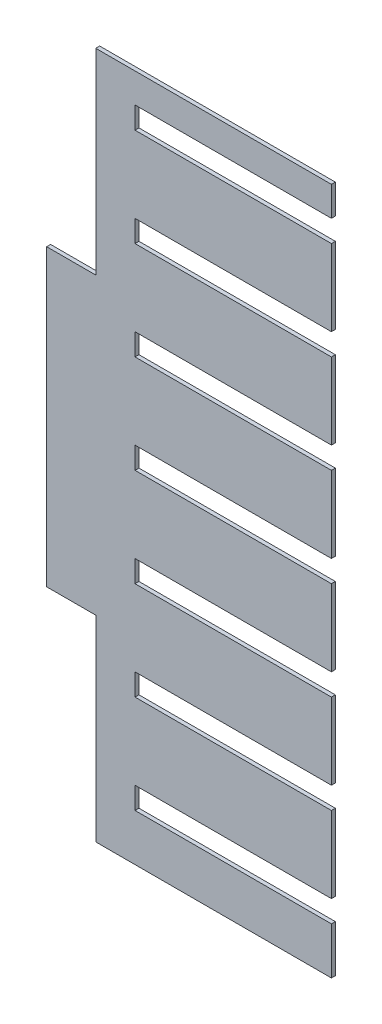
ISO-10303-21;
HEADER;
FILE_DESCRIPTION(('STEP AP214'),'2;1');
FILE_NAME('part.step','',(''),(''),'','','');
FILE_SCHEMA(('AUTOMOTIVE_DESIGN { 1 0 10303 214 1 1 1 1 }'));
ENDSEC;
DATA;
#1=APPLICATION_CONTEXT('core data for automotive mechanical design processes');
#2=APPLICATION_PROTOCOL_DEFINITION('international standard','automotive_design',2000,#1);
#3=PRODUCT_CONTEXT('',#1,'mechanical');
#4=PRODUCT('Part','Part','',(#3));
#5=PRODUCT_RELATED_PRODUCT_CATEGORY('part','',(#4));
#6=PRODUCT_DEFINITION_FORMATION('','',#4);
#7=PRODUCT_DEFINITION_CONTEXT('part definition',#1,'design');
#8=PRODUCT_DEFINITION('design','',#6,#7);
#9=PRODUCT_DEFINITION_SHAPE('','',#8);
#10=(LENGTH_UNIT() NAMED_UNIT(*) SI_UNIT(.MILLI.,.METRE.));
#11=(NAMED_UNIT(*) PLANE_ANGLE_UNIT() SI_UNIT($,.RADIAN.));
#12=(NAMED_UNIT(*) SI_UNIT($,.STERADIAN.) SOLID_ANGLE_UNIT());
#13=UNCERTAINTY_MEASURE_WITH_UNIT(LENGTH_MEASURE(1.E-05),#10,'distance_accuracy_value','');
#14=(GEOMETRIC_REPRESENTATION_CONTEXT(3) GLOBAL_UNCERTAINTY_ASSIGNED_CONTEXT((#13)) GLOBAL_UNIT_ASSIGNED_CONTEXT((#10,
#11,#12)) REPRESENTATION_CONTEXT('',''));
#15=CARTESIAN_POINT('',(0.,0.,0.));
#16=DIRECTION('',(0.,0.,1.));
#17=DIRECTION('',(1.,0.,0.));
#18=AXIS2_PLACEMENT_3D('',#15,#16,#17);
#19=CARTESIAN_POINT('',(-30.0000000000001,-151.123940721398,0.));
#20=DIRECTION('',(0.,-1.,0.));
#21=DIRECTION('',(0.,0.,-1.));
#22=AXIS2_PLACEMENT_3D('',#19,#20,#21);
#23=PLANE('',#22);
#24=DIRECTION('',(1.,0.,0.));
#25=VECTOR('',#24,1.);
#26=CARTESIAN_POINT('',(-30.0000000000001,-151.123940721398,2.));
#27=LINE('',#26,#25);
#28=CARTESIAN_POINT('',(-130.,-151.123940721398,2.));
#29=VERTEX_POINT('',#28);
#30=CARTESIAN_POINT('',(-30.,-151.123940721398,2.));
#31=VERTEX_POINT('',#30);
#32=EDGE_CURVE('E452',#29,#31,#27,.T.);
#33=ORIENTED_EDGE('',*,*,#32,.T.);
#34=DIRECTION('',(0.,0.,1.));
#35=VECTOR('',#34,1.);
#36=CARTESIAN_POINT('',(-30.0000000000001,-151.123940721398,0.));
#37=LINE('',#36,#35);
#38=CARTESIAN_POINT('',(-30.,-151.123940721398,0.));
#39=VERTEX_POINT('',#38);
#40=EDGE_CURVE('E11',#39,#31,#37,.T.);
#41=ORIENTED_EDGE('',*,*,#40,.F.);
#42=DIRECTION('',(1.,0.,0.));
#43=VECTOR('',#42,1.);
#44=CARTESIAN_POINT('',(-30.0000000000001,-151.123940721398,0.));
#45=LINE('',#44,#43);
#46=CARTESIAN_POINT('',(-130.,-151.123940721398,0.));
#47=VERTEX_POINT('',#46);
#48=EDGE_CURVE('E456',#47,#39,#45,.T.);
#49=ORIENTED_EDGE('',*,*,#48,.F.);
#50=DIRECTION('',(0.,0.,1.));
#51=VECTOR('',#50,1.);
#52=CARTESIAN_POINT('',(-130.,-151.123940721398,0.));
#53=LINE('',#52,#51);
#54=EDGE_CURVE('E461',#47,#29,#53,.T.);
#55=ORIENTED_EDGE('',*,*,#54,.T.);
#56=EDGE_LOOP('',(#33,#41,#49,#55));
#57=FACE_BOUND('',#56,.T.);
#58=ADVANCED_FACE('F34',(#57),#23,.F.);
#59=CARTESIAN_POINT('',(-130.,-140.,0.));
#60=DIRECTION('',(0.,1.,0.));
#61=DIRECTION('',(-1.,0.,0.));
#62=AXIS2_PLACEMENT_3D('',#59,#60,#61);
#63=PLANE('',#62);
#64=DIRECTION('',(-1.,0.,0.));
#65=VECTOR('',#64,1.);
#66=CARTESIAN_POINT('',(-130.,-140.,2.));
#67=LINE('',#66,#65);
#68=CARTESIAN_POINT('',(-30.,-140.,2.));
#69=VERTEX_POINT('',#68);
#70=CARTESIAN_POINT('',(-130.,-140.,2.));
#71=VERTEX_POINT('',#70);
#72=EDGE_CURVE('E449',#69,#71,#67,.T.);
#73=ORIENTED_EDGE('',*,*,#72,.T.);
#74=DIRECTION('',(0.,0.,1.));
#75=VECTOR('',#74,1.);
#76=CARTESIAN_POINT('',(-130.,-140.,0.));
#77=LINE('',#76,#75);
#78=CARTESIAN_POINT('',(-130.,-140.,0.));
#79=VERTEX_POINT('',#78);
#80=EDGE_CURVE('E464',#79,#71,#77,.T.);
#81=ORIENTED_EDGE('',*,*,#80,.F.);
#82=DIRECTION('',(-1.,0.,0.));
#83=VECTOR('',#82,1.);
#84=CARTESIAN_POINT('',(-130.,-140.,0.));
#85=LINE('',#84,#83);
#86=CARTESIAN_POINT('',(-30.0000000000001,-140.,0.));
#87=VERTEX_POINT('',#86);
#88=EDGE_CURVE('E459',#87,#79,#85,.T.);
#89=ORIENTED_EDGE('',*,*,#88,.F.);
#90=DIRECTION('',(0.,0.,1.));
#91=VECTOR('',#90,1.);
#92=CARTESIAN_POINT('',(-30.0000000000001,-140.,0.));
#93=LINE('',#92,#91);
#94=EDGE_CURVE('E41',#87,#69,#93,.T.);
#95=ORIENTED_EDGE('',*,*,#94,.T.);
#96=EDGE_LOOP('',(#73,#81,#89,#95));
#97=FACE_BOUND('',#96,.T.);
#98=ADVANCED_FACE('F468',(#97),#63,.F.);
#99=CARTESIAN_POINT('',(-130.,-151.123940721398,0.));
#100=DIRECTION('',(-1.,0.,0.));
#101=DIRECTION('',(0.,0.,1.));
#102=AXIS2_PLACEMENT_3D('',#99,#100,#101);
#103=PLANE('',#102);
#104=DIRECTION('',(0.,-1.,0.));
#105=VECTOR('',#104,1.);
#106=CARTESIAN_POINT('',(-130.,-151.123940721398,2.));
#107=LINE('',#106,#105);
#108=EDGE_CURVE('E447',#71,#29,#107,.T.);
#109=ORIENTED_EDGE('',*,*,#108,.T.);
#110=ORIENTED_EDGE('',*,*,#54,.F.);
#111=DIRECTION('',(0.,-1.,0.));
#112=VECTOR('',#111,1.);
#113=CARTESIAN_POINT('',(-130.,-151.123940721398,0.));
#114=LINE('',#113,#112);
#115=EDGE_CURVE('E56',#79,#47,#114,.T.);
#116=ORIENTED_EDGE('',*,*,#115,.F.);
#117=ORIENTED_EDGE('',*,*,#80,.T.);
#118=EDGE_LOOP('',(#109,#110,#116,#117));
#119=FACE_BOUND('',#118,.T.);
#120=ADVANCED_FACE('F580',(#119),#103,.F.);
#121=CARTESIAN_POINT('',(-30.0000000000001,-101.123940721397,0.));
#122=DIRECTION('',(0.,-1.,0.));
#123=DIRECTION('',(0.,0.,-1.));
#124=AXIS2_PLACEMENT_3D('',#121,#122,#123);
#125=PLANE('',#124);
#126=DIRECTION('',(1.,0.,0.));
#127=VECTOR('',#126,1.);
#128=CARTESIAN_POINT('',(-30.0000000000001,-101.123940721397,2.));
#129=LINE('',#128,#127);
#130=CARTESIAN_POINT('',(-130.,-101.123940721397,2.));
#131=VERTEX_POINT('',#130);
#132=CARTESIAN_POINT('',(-30.,-101.123940721397,2.));
#133=VERTEX_POINT('',#132);
#134=EDGE_CURVE('E425',#131,#133,#129,.T.);
#135=ORIENTED_EDGE('',*,*,#134,.T.);
#136=DIRECTION('',(0.,0.,1.));
#137=VECTOR('',#136,1.);
#138=CARTESIAN_POINT('',(-30.0000000000001,-101.123940721397,0.));
#139=LINE('',#138,#137);
#140=CARTESIAN_POINT('',(-30.,-101.123940721397,0.));
#141=VERTEX_POINT('',#140);
#142=EDGE_CURVE('E445',#141,#133,#139,.T.);
#143=ORIENTED_EDGE('',*,*,#142,.F.);
#144=DIRECTION('',(1.,0.,0.));
#145=VECTOR('',#144,1.);
#146=CARTESIAN_POINT('',(-30.0000000000001,-101.123940721397,0.));
#147=LINE('',#146,#145);
#148=CARTESIAN_POINT('',(-130.,-101.123940721397,0.));
#149=VERTEX_POINT('',#148);
#150=EDGE_CURVE('E430',#149,#141,#147,.T.);
#151=ORIENTED_EDGE('',*,*,#150,.F.);
#152=DIRECTION('',(0.,0.,1.));
#153=VECTOR('',#152,1.);
#154=CARTESIAN_POINT('',(-130.,-101.123940721397,0.));
#155=LINE('',#154,#153);
#156=EDGE_CURVE('E436',#149,#131,#155,.T.);
#157=ORIENTED_EDGE('',*,*,#156,.T.);
#158=EDGE_LOOP('',(#135,#143,#151,#157));
#159=FACE_BOUND('',#158,.T.);
#160=ADVANCED_FACE('F582',(#159),#125,.F.);
#161=CARTESIAN_POINT('',(-130.,-90.,0.));
#162=DIRECTION('',(0.,1.,0.));
#163=DIRECTION('',(-1.,0.,0.));
#164=AXIS2_PLACEMENT_3D('',#161,#162,#163);
#165=PLANE('',#164);
#166=DIRECTION('',(-1.,0.,0.));
#167=VECTOR('',#166,1.);
#168=CARTESIAN_POINT('',(-130.,-90.,2.));
#169=LINE('',#168,#167);
#170=CARTESIAN_POINT('',(-30.,-90.,2.));
#171=VERTEX_POINT('',#170);
#172=CARTESIAN_POINT('',(-130.,-90.,2.));
#173=VERTEX_POINT('',#172);
#174=EDGE_CURVE('E422',#171,#173,#169,.T.);
#175=ORIENTED_EDGE('',*,*,#174,.T.);
#176=DIRECTION('',(0.,0.,1.));
#177=VECTOR('',#176,1.);
#178=CARTESIAN_POINT('',(-130.,-90.,0.));
#179=LINE('',#178,#177);
#180=CARTESIAN_POINT('',(-130.,-90.,0.));
#181=VERTEX_POINT('',#180);
#182=EDGE_CURVE('E439',#181,#173,#179,.T.);
#183=ORIENTED_EDGE('',*,*,#182,.F.);
#184=DIRECTION('',(-1.,0.,0.));
#185=VECTOR('',#184,1.);
#186=CARTESIAN_POINT('',(-130.,-90.,0.));
#187=LINE('',#186,#185);
#188=CARTESIAN_POINT('',(-30.0000000000001,-90.,0.));
#189=VERTEX_POINT('',#188);
#190=EDGE_CURVE('E433',#189,#181,#187,.T.);
#191=ORIENTED_EDGE('',*,*,#190,.F.);
#192=DIRECTION('',(0.,0.,1.));
#193=VECTOR('',#192,1.);
#194=CARTESIAN_POINT('',(-30.0000000000001,-90.,0.));
#195=LINE('',#194,#193);
#196=EDGE_CURVE('E442',#189,#171,#195,.T.);
#197=ORIENTED_EDGE('',*,*,#196,.T.);
#198=EDGE_LOOP('',(#175,#183,#191,#197));
#199=FACE_BOUND('',#198,.T.);
#200=ADVANCED_FACE('F588',(#199),#165,.F.);
#201=CARTESIAN_POINT('',(-130.,-101.123940721397,0.));
#202=DIRECTION('',(-1.,0.,0.));
#203=DIRECTION('',(0.,0.,1.));
#204=AXIS2_PLACEMENT_3D('',#201,#202,#203);
#205=PLANE('',#204);
#206=DIRECTION('',(0.,-1.,0.));
#207=VECTOR('',#206,1.);
#208=CARTESIAN_POINT('',(-130.,-101.123940721397,2.));
#209=LINE('',#208,#207);
#210=EDGE_CURVE('E420',#173,#131,#209,.T.);
#211=ORIENTED_EDGE('',*,*,#210,.T.);
#212=ORIENTED_EDGE('',*,*,#156,.F.);
#213=DIRECTION('',(0.,-1.,0.));
#214=VECTOR('',#213,1.);
#215=CARTESIAN_POINT('',(-130.,-101.123940721397,0.));
#216=LINE('',#215,#214);
#217=EDGE_CURVE('E428',#181,#149,#216,.T.);
#218=ORIENTED_EDGE('',*,*,#217,.F.);
#219=ORIENTED_EDGE('',*,*,#182,.T.);
#220=EDGE_LOOP('',(#211,#212,#218,#219));
#221=FACE_BOUND('',#220,.T.);
#222=ADVANCED_FACE('F615',(#221),#205,.F.);
#223=CARTESIAN_POINT('',(-30.0000000000001,-51.1239407213975,0.));
#224=DIRECTION('',(0.,-1.,0.));
#225=DIRECTION('',(0.,0.,-1.));
#226=AXIS2_PLACEMENT_3D('',#223,#224,#225);
#227=PLANE('',#226);
#228=DIRECTION('',(1.,0.,0.));
#229=VECTOR('',#228,1.);
#230=CARTESIAN_POINT('',(-30.0000000000001,-51.1239407213975,2.));
#231=LINE('',#230,#229);
#232=CARTESIAN_POINT('',(-130.,-51.1239407213975,2.));
#233=VERTEX_POINT('',#232);
#234=CARTESIAN_POINT('',(-30.0000000000001,-51.1239407213975,2.));
#235=VERTEX_POINT('',#234);
#236=EDGE_CURVE('E398',#233,#235,#231,.T.);
#237=ORIENTED_EDGE('',*,*,#236,.T.);
#238=DIRECTION('',(0.,0.,1.));
#239=VECTOR('',#238,1.);
#240=CARTESIAN_POINT('',(-30.0000000000001,-51.1239407213975,0.));
#241=LINE('',#240,#239);
#242=CARTESIAN_POINT('',(-30.0000000000001,-51.1239407213975,0.));
#243=VERTEX_POINT('',#242);
#244=EDGE_CURVE('E418',#243,#235,#241,.T.);
#245=ORIENTED_EDGE('',*,*,#244,.F.);
#246=DIRECTION('',(1.,0.,0.));
#247=VECTOR('',#246,1.);
#248=CARTESIAN_POINT('',(-30.0000000000001,-51.1239407213975,0.));
#249=LINE('',#248,#247);
#250=CARTESIAN_POINT('',(-130.,-51.1239407213975,0.));
#251=VERTEX_POINT('',#250);
#252=EDGE_CURVE('E403',#251,#243,#249,.T.);
#253=ORIENTED_EDGE('',*,*,#252,.F.);
#254=DIRECTION('',(0.,0.,1.));
#255=VECTOR('',#254,1.);
#256=CARTESIAN_POINT('',(-130.,-51.1239407213975,0.));
#257=LINE('',#256,#255);
#258=EDGE_CURVE('E409',#251,#233,#257,.T.);
#259=ORIENTED_EDGE('',*,*,#258,.T.);
#260=EDGE_LOOP('',(#237,#245,#253,#259));
#261=FACE_BOUND('',#260,.T.);
#262=ADVANCED_FACE('F623',(#261),#227,.F.);
#263=CARTESIAN_POINT('',(-130.,-40.,0.));
#264=DIRECTION('',(0.,1.,0.));
#265=DIRECTION('',(-1.,0.,0.));
#266=AXIS2_PLACEMENT_3D('',#263,#264,#265);
#267=PLANE('',#266);
#268=DIRECTION('',(-1.,0.,0.));
#269=VECTOR('',#268,1.);
#270=CARTESIAN_POINT('',(-130.,-40.,2.));
#271=LINE('',#270,#269);
#272=CARTESIAN_POINT('',(-30.0000000000001,-40.,2.));
#273=VERTEX_POINT('',#272);
#274=CARTESIAN_POINT('',(-130.,-40.,2.));
#275=VERTEX_POINT('',#274);
#276=EDGE_CURVE('E395',#273,#275,#271,.T.);
#277=ORIENTED_EDGE('',*,*,#276,.T.);
#278=DIRECTION('',(0.,0.,1.));
#279=VECTOR('',#278,1.);
#280=CARTESIAN_POINT('',(-130.,-40.,0.));
#281=LINE('',#280,#279);
#282=CARTESIAN_POINT('',(-130.,-40.,0.));
#283=VERTEX_POINT('',#282);
#284=EDGE_CURVE('E412',#283,#275,#281,.T.);
#285=ORIENTED_EDGE('',*,*,#284,.F.);
#286=DIRECTION('',(-1.,0.,0.));
#287=VECTOR('',#286,1.);
#288=CARTESIAN_POINT('',(-130.,-40.,0.));
#289=LINE('',#288,#287);
#290=CARTESIAN_POINT('',(-30.0000000000001,-40.,0.));
#291=VERTEX_POINT('',#290);
#292=EDGE_CURVE('E406',#291,#283,#289,.T.);
#293=ORIENTED_EDGE('',*,*,#292,.F.);
#294=DIRECTION('',(0.,0.,1.));
#295=VECTOR('',#294,1.);
#296=CARTESIAN_POINT('',(-30.0000000000001,-40.,0.));
#297=LINE('',#296,#295);
#298=EDGE_CURVE('E415',#291,#273,#297,.T.);
#299=ORIENTED_EDGE('',*,*,#298,.T.);
#300=EDGE_LOOP('',(#277,#285,#293,#299));
#301=FACE_BOUND('',#300,.T.);
#302=ADVANCED_FACE('F628',(#301),#267,.F.);
#303=CARTESIAN_POINT('',(-130.,-51.1239407213975,0.));
#304=DIRECTION('',(-1.,0.,0.));
#305=DIRECTION('',(0.,0.,1.));
#306=AXIS2_PLACEMENT_3D('',#303,#304,#305);
#307=PLANE('',#306);
#308=DIRECTION('',(0.,-1.,0.));
#309=VECTOR('',#308,1.);
#310=CARTESIAN_POINT('',(-130.,-51.1239407213975,2.));
#311=LINE('',#310,#309);
#312=EDGE_CURVE('E393',#275,#233,#311,.T.);
#313=ORIENTED_EDGE('',*,*,#312,.T.);
#314=ORIENTED_EDGE('',*,*,#258,.F.);
#315=DIRECTION('',(0.,-1.,0.));
#316=VECTOR('',#315,1.);
#317=CARTESIAN_POINT('',(-130.,-51.1239407213975,0.));
#318=LINE('',#317,#316);
#319=EDGE_CURVE('E401',#283,#251,#318,.T.);
#320=ORIENTED_EDGE('',*,*,#319,.F.);
#321=ORIENTED_EDGE('',*,*,#284,.T.);
#322=EDGE_LOOP('',(#313,#314,#320,#321));
#323=FACE_BOUND('',#322,.T.);
#324=ADVANCED_FACE('F638',(#323),#307,.F.);
#325=CARTESIAN_POINT('',(-30.0000000000001,-1.12394072139749,0.));
#326=DIRECTION('',(0.,-1.,0.));
#327=DIRECTION('',(0.,0.,-1.));
#328=AXIS2_PLACEMENT_3D('',#325,#326,#327);
#329=PLANE('',#328);
#330=DIRECTION('',(1.,0.,0.));
#331=VECTOR('',#330,1.);
#332=CARTESIAN_POINT('',(-30.0000000000001,-1.12394072139749,2.));
#333=LINE('',#332,#331);
#334=CARTESIAN_POINT('',(-130.,-1.12394072139749,2.));
#335=VERTEX_POINT('',#334);
#336=CARTESIAN_POINT('',(-30.0000000000001,-1.12394072139749,2.));
#337=VERTEX_POINT('',#336);
#338=EDGE_CURVE('E371',#335,#337,#333,.T.);
#339=ORIENTED_EDGE('',*,*,#338,.T.);
#340=DIRECTION('',(0.,0.,1.));
#341=VECTOR('',#340,1.);
#342=CARTESIAN_POINT('',(-30.0000000000001,-1.12394072139749,0.));
#343=LINE('',#342,#341);
#344=CARTESIAN_POINT('',(-30.0000000000001,-1.12394072139749,0.));
#345=VERTEX_POINT('',#344);
#346=EDGE_CURVE('E391',#345,#337,#343,.T.);
#347=ORIENTED_EDGE('',*,*,#346,.F.);
#348=DIRECTION('',(1.,0.,0.));
#349=VECTOR('',#348,1.);
#350=CARTESIAN_POINT('',(-30.0000000000001,-1.12394072139749,0.));
#351=LINE('',#350,#349);
#352=CARTESIAN_POINT('',(-130.,-1.12394072139749,0.));
#353=VERTEX_POINT('',#352);
#354=EDGE_CURVE('E376',#353,#345,#351,.T.);
#355=ORIENTED_EDGE('',*,*,#354,.F.);
#356=DIRECTION('',(0.,0.,1.));
#357=VECTOR('',#356,1.);
#358=CARTESIAN_POINT('',(-130.,-1.12394072139749,0.));
#359=LINE('',#358,#357);
#360=EDGE_CURVE('E382',#353,#335,#359,.T.);
#361=ORIENTED_EDGE('',*,*,#360,.T.);
#362=EDGE_LOOP('',(#339,#347,#355,#361));
#363=FACE_BOUND('',#362,.T.);
#364=ADVANCED_FACE('F646',(#363),#329,.F.);
#365=CARTESIAN_POINT('',(-130.,9.99999999999998,0.));
#366=DIRECTION('',(0.,1.,0.));
#367=DIRECTION('',(-1.,0.,0.));
#368=AXIS2_PLACEMENT_3D('',#365,#366,#367);
#369=PLANE('',#368);
#370=DIRECTION('',(-1.,0.,0.));
#371=VECTOR('',#370,1.);
#372=CARTESIAN_POINT('',(-130.,9.99999999999998,2.));
#373=LINE('',#372,#371);
#374=CARTESIAN_POINT('',(-30.0000000000001,9.99999999999995,2.));
#375=VERTEX_POINT('',#374);
#376=CARTESIAN_POINT('',(-130.,9.99999999999998,2.));
#377=VERTEX_POINT('',#376);
#378=EDGE_CURVE('E368',#375,#377,#373,.T.);
#379=ORIENTED_EDGE('',*,*,#378,.T.);
#380=DIRECTION('',(0.,0.,1.));
#381=VECTOR('',#380,1.);
#382=CARTESIAN_POINT('',(-130.,9.99999999999998,0.));
#383=LINE('',#382,#381);
#384=CARTESIAN_POINT('',(-130.,9.99999999999998,0.));
#385=VERTEX_POINT('',#384);
#386=EDGE_CURVE('E385',#385,#377,#383,.T.);
#387=ORIENTED_EDGE('',*,*,#386,.F.);
#388=DIRECTION('',(-1.,0.,0.));
#389=VECTOR('',#388,1.);
#390=CARTESIAN_POINT('',(-130.,9.99999999999998,0.));
#391=LINE('',#390,#389);
#392=CARTESIAN_POINT('',(-30.0000000000001,9.99999999999995,0.));
#393=VERTEX_POINT('',#392);
#394=EDGE_CURVE('E379',#393,#385,#391,.T.);
#395=ORIENTED_EDGE('',*,*,#394,.F.);
#396=DIRECTION('',(0.,0.,1.));
#397=VECTOR('',#396,1.);
#398=CARTESIAN_POINT('',(-30.0000000000001,9.99999999999995,0.));
#399=LINE('',#398,#397);
#400=EDGE_CURVE('E388',#393,#375,#399,.T.);
#401=ORIENTED_EDGE('',*,*,#400,.T.);
#402=EDGE_LOOP('',(#379,#387,#395,#401));
#403=FACE_BOUND('',#402,.T.);
#404=ADVANCED_FACE('F651',(#403),#369,.F.);
#405=CARTESIAN_POINT('',(-130.,-1.12394072139749,0.));
#406=DIRECTION('',(-1.,0.,0.));
#407=DIRECTION('',(0.,0.,1.));
#408=AXIS2_PLACEMENT_3D('',#405,#406,#407);
#409=PLANE('',#408);
#410=DIRECTION('',(0.,-1.,0.));
#411=VECTOR('',#410,1.);
#412=CARTESIAN_POINT('',(-130.,-1.12394072139749,2.));
#413=LINE('',#412,#411);
#414=EDGE_CURVE('E366',#377,#335,#413,.T.);
#415=ORIENTED_EDGE('',*,*,#414,.T.);
#416=ORIENTED_EDGE('',*,*,#360,.F.);
#417=DIRECTION('',(0.,-1.,0.));
#418=VECTOR('',#417,1.);
#419=CARTESIAN_POINT('',(-130.,-1.12394072139749,0.));
#420=LINE('',#419,#418);
#421=EDGE_CURVE('E374',#385,#353,#420,.T.);
#422=ORIENTED_EDGE('',*,*,#421,.F.);
#423=ORIENTED_EDGE('',*,*,#386,.T.);
#424=EDGE_LOOP('',(#415,#416,#422,#423));
#425=FACE_BOUND('',#424,.T.);
#426=ADVANCED_FACE('F661',(#425),#409,.F.);
#427=CARTESIAN_POINT('',(-30.0000000000001,48.8760592786025,0.));
#428=DIRECTION('',(0.,-1.,0.));
#429=DIRECTION('',(0.,0.,-1.));
#430=AXIS2_PLACEMENT_3D('',#427,#428,#429);
#431=PLANE('',#430);
#432=DIRECTION('',(1.,0.,0.));
#433=VECTOR('',#432,1.);
#434=CARTESIAN_POINT('',(-30.0000000000001,48.8760592786025,2.));
#435=LINE('',#434,#433);
#436=CARTESIAN_POINT('',(-130.,48.8760592786025,2.));
#437=VERTEX_POINT('',#436);
#438=CARTESIAN_POINT('',(-30.0000000000001,48.8760592786025,2.));
#439=VERTEX_POINT('',#438);
#440=EDGE_CURVE('E344',#437,#439,#435,.T.);
#441=ORIENTED_EDGE('',*,*,#440,.T.);
#442=DIRECTION('',(0.,0.,1.));
#443=VECTOR('',#442,1.);
#444=CARTESIAN_POINT('',(-30.0000000000001,48.8760592786025,0.));
#445=LINE('',#444,#443);
#446=CARTESIAN_POINT('',(-30.0000000000001,48.8760592786025,0.));
#447=VERTEX_POINT('',#446);
#448=EDGE_CURVE('E364',#447,#439,#445,.T.);
#449=ORIENTED_EDGE('',*,*,#448,.F.);
#450=DIRECTION('',(1.,0.,0.));
#451=VECTOR('',#450,1.);
#452=CARTESIAN_POINT('',(-30.0000000000001,48.8760592786025,0.));
#453=LINE('',#452,#451);
#454=CARTESIAN_POINT('',(-130.,48.8760592786025,0.));
#455=VERTEX_POINT('',#454);
#456=EDGE_CURVE('E349',#455,#447,#453,.T.);
#457=ORIENTED_EDGE('',*,*,#456,.F.);
#458=DIRECTION('',(0.,0.,1.));
#459=VECTOR('',#458,1.);
#460=CARTESIAN_POINT('',(-130.,48.8760592786025,0.));
#461=LINE('',#460,#459);
#462=EDGE_CURVE('E355',#455,#437,#461,.T.);
#463=ORIENTED_EDGE('',*,*,#462,.T.);
#464=EDGE_LOOP('',(#441,#449,#457,#463));
#465=FACE_BOUND('',#464,.T.);
#466=ADVANCED_FACE('F669',(#465),#431,.F.);
#467=CARTESIAN_POINT('',(-130.,60.,0.));
#468=DIRECTION('',(0.,1.,0.));
#469=DIRECTION('',(-1.,0.,0.));
#470=AXIS2_PLACEMENT_3D('',#467,#468,#469);
#471=PLANE('',#470);
#472=DIRECTION('',(-1.,0.,0.));
#473=VECTOR('',#472,1.);
#474=CARTESIAN_POINT('',(-130.,60.,2.));
#475=LINE('',#474,#473);
#476=CARTESIAN_POINT('',(-30.0000000000001,60.,2.));
#477=VERTEX_POINT('',#476);
#478=CARTESIAN_POINT('',(-130.,60.,2.));
#479=VERTEX_POINT('',#478);
#480=EDGE_CURVE('E341',#477,#479,#475,.T.);
#481=ORIENTED_EDGE('',*,*,#480,.T.);
#482=DIRECTION('',(0.,0.,1.));
#483=VECTOR('',#482,1.);
#484=CARTESIAN_POINT('',(-130.,60.,0.));
#485=LINE('',#484,#483);
#486=CARTESIAN_POINT('',(-130.,60.,0.));
#487=VERTEX_POINT('',#486);
#488=EDGE_CURVE('E358',#487,#479,#485,.T.);
#489=ORIENTED_EDGE('',*,*,#488,.F.);
#490=DIRECTION('',(-1.,0.,0.));
#491=VECTOR('',#490,1.);
#492=CARTESIAN_POINT('',(-130.,60.,0.));
#493=LINE('',#492,#491);
#494=CARTESIAN_POINT('',(-30.0000000000001,60.,0.));
#495=VERTEX_POINT('',#494);
#496=EDGE_CURVE('E352',#495,#487,#493,.T.);
#497=ORIENTED_EDGE('',*,*,#496,.F.);
#498=DIRECTION('',(0.,0.,1.));
#499=VECTOR('',#498,1.);
#500=CARTESIAN_POINT('',(-30.0000000000001,60.,0.));
#501=LINE('',#500,#499);
#502=EDGE_CURVE('E361',#495,#477,#501,.T.);
#503=ORIENTED_EDGE('',*,*,#502,.T.);
#504=EDGE_LOOP('',(#481,#489,#497,#503));
#505=FACE_BOUND('',#504,.T.);
#506=ADVANCED_FACE('F674',(#505),#471,.F.);
#507=CARTESIAN_POINT('',(-130.,48.8760592786025,0.));
#508=DIRECTION('',(-1.,0.,0.));
#509=DIRECTION('',(0.,0.,1.));
#510=AXIS2_PLACEMENT_3D('',#507,#508,#509);
#511=PLANE('',#510);
#512=DIRECTION('',(0.,-1.,0.));
#513=VECTOR('',#512,1.);
#514=CARTESIAN_POINT('',(-130.,48.8760592786025,2.));
#515=LINE('',#514,#513);
#516=EDGE_CURVE('E339',#479,#437,#515,.T.);
#517=ORIENTED_EDGE('',*,*,#516,.T.);
#518=ORIENTED_EDGE('',*,*,#462,.F.);
#519=DIRECTION('',(0.,-1.,0.));
#520=VECTOR('',#519,1.);
#521=CARTESIAN_POINT('',(-130.,48.8760592786025,0.));
#522=LINE('',#521,#520);
#523=EDGE_CURVE('E347',#487,#455,#522,.T.);
#524=ORIENTED_EDGE('',*,*,#523,.F.);
#525=ORIENTED_EDGE('',*,*,#488,.T.);
#526=EDGE_LOOP('',(#517,#518,#524,#525));
#527=FACE_BOUND('',#526,.T.);
#528=ADVANCED_FACE('F684',(#527),#511,.F.);
#529=CARTESIAN_POINT('',(-150.,-175.,2.));
#530=DIRECTION('',(0.,1.,0.));
#531=DIRECTION('',(0.,0.,1.));
#532=AXIS2_PLACEMENT_3D('',#529,#530,#531);
#533=PLANE('',#532);
#534=DIRECTION('',(1.,0.,0.));
#535=VECTOR('',#534,1.);
#536=CARTESIAN_POINT('',(-150.,-175.,0.));
#537=LINE('',#536,#535);
#538=CARTESIAN_POINT('',(-150.,-175.,0.));
#539=VERTEX_POINT('',#538);
#540=CARTESIAN_POINT('',(-30.0000000000001,-175.,0.));
#541=VERTEX_POINT('',#540);
#542=EDGE_CURVE('E309',#539,#541,#537,.T.);
#543=ORIENTED_EDGE('',*,*,#542,.T.);
#544=DIRECTION('',(0.,0.,1.));
#545=VECTOR('',#544,1.);
#546=CARTESIAN_POINT('',(-30.,-175.,-0.00100000000000013));
#547=LINE('',#546,#545);
#548=CARTESIAN_POINT('',(-30.,-175.,2.));
#549=VERTEX_POINT('',#548);
#550=EDGE_CURVE('E48',#541,#549,#547,.T.);
#551=ORIENTED_EDGE('',*,*,#550,.T.);
#552=DIRECTION('',(1.,0.,0.));
#553=VECTOR('',#552,1.);
#554=CARTESIAN_POINT('',(-150.,-175.,2.));
#555=LINE('',#554,#553);
#556=CARTESIAN_POINT('',(-150.,-175.,2.));
#557=VERTEX_POINT('',#556);
#558=EDGE_CURVE('E292',#557,#549,#555,.T.);
#559=ORIENTED_EDGE('',*,*,#558,.F.);
#560=DIRECTION('',(0.,0.,-1.));
#561=VECTOR('',#560,1.);
#562=CARTESIAN_POINT('',(-150.,-175.,2.));
#563=LINE('',#562,#561);
#564=EDGE_CURVE('E308',#557,#539,#563,.T.);
#565=ORIENTED_EDGE('',*,*,#564,.T.);
#566=EDGE_LOOP('',(#543,#551,#559,#565));
#567=FACE_BOUND('',#566,.T.);
#568=ADVANCED_FACE('F568',(#567),#533,.F.);
#569=CARTESIAN_POINT('',(-15.0000000000001,175.,2.));
#570=DIRECTION('',(0.,-1.,0.));
#571=DIRECTION('',(0.,0.,-1.));
#572=AXIS2_PLACEMENT_3D('',#569,#570,#571);
#573=PLANE('',#572);
#574=DIRECTION('',(-1.,0.,0.));
#575=VECTOR('',#574,1.);
#576=CARTESIAN_POINT('',(-15.0000000000001,175.,2.));
#577=LINE('',#576,#575);
#578=CARTESIAN_POINT('',(-30.0000000000001,175.,2.));
#579=VERTEX_POINT('',#578);
#580=CARTESIAN_POINT('',(-150.,175.,2.));
#581=VERTEX_POINT('',#580);
#582=EDGE_CURVE('E279',#579,#581,#577,.T.);
#583=ORIENTED_EDGE('',*,*,#582,.F.);
#584=DIRECTION('',(0.,0.,1.));
#585=VECTOR('',#584,1.);
#586=CARTESIAN_POINT('',(-30.0000000000001,175.,-0.00100000000000013));
#587=LINE('',#586,#585);
#588=CARTESIAN_POINT('',(-30.0000000000001,175.,0.));
#589=VERTEX_POINT('',#588);
#590=EDGE_CURVE('E265',#589,#579,#587,.T.);
#591=ORIENTED_EDGE('',*,*,#590,.F.);
#592=DIRECTION('',(-1.,0.,0.));
#593=VECTOR('',#592,1.);
#594=CARTESIAN_POINT('',(-15.0000000000001,175.,0.));
#595=LINE('',#594,#593);
#596=CARTESIAN_POINT('',(-150.,175.,0.));
#597=VERTEX_POINT('',#596);
#598=EDGE_CURVE('E312',#589,#597,#595,.T.);
#599=ORIENTED_EDGE('',*,*,#598,.T.);
#600=DIRECTION('',(0.,0.,-1.));
#601=VECTOR('',#600,1.);
#602=CARTESIAN_POINT('',(-150.,175.,2.));
#603=LINE('',#602,#601);
#604=EDGE_CURVE('E289',#581,#597,#603,.T.);
#605=ORIENTED_EDGE('',*,*,#604,.F.);
#606=EDGE_LOOP('',(#583,#591,#599,#605));
#607=FACE_BOUND('',#606,.T.);
#608=ADVANCED_FACE('F287',(#607),#573,.F.);
#609=CARTESIAN_POINT('',(-150.,175.,2.));
#610=DIRECTION('',(1.,0.,0.));
#611=DIRECTION('',(0.,0.,-1.));
#612=AXIS2_PLACEMENT_3D('',#609,#610,#611);
#613=PLANE('',#612);
#614=DIRECTION('',(0.,-1.,0.));
#615=VECTOR('',#614,1.);
#616=CARTESIAN_POINT('',(-150.,175.,0.));
#617=LINE('',#616,#615);
#618=CARTESIAN_POINT('',(-150.,75.,0.));
#619=VERTEX_POINT('',#618);
#620=EDGE_CURVE('E315',#597,#619,#617,.T.);
#621=ORIENTED_EDGE('',*,*,#620,.T.);
#622=DIRECTION('',(0.,0.,-1.));
#623=VECTOR('',#622,1.);
#624=CARTESIAN_POINT('',(-150.,75.,2.));
#625=LINE('',#624,#623);
#626=CARTESIAN_POINT('',(-150.,75.,2.));
#627=VERTEX_POINT('',#626);
#628=EDGE_CURVE('E335',#627,#619,#625,.T.);
#629=ORIENTED_EDGE('',*,*,#628,.F.);
#630=DIRECTION('',(0.,-1.,0.));
#631=VECTOR('',#630,1.);
#632=CARTESIAN_POINT('',(-150.,175.,2.));
#633=LINE('',#632,#631);
#634=EDGE_CURVE('E291',#581,#627,#633,.T.);
#635=ORIENTED_EDGE('',*,*,#634,.F.);
#636=ORIENTED_EDGE('',*,*,#604,.T.);
#637=EDGE_LOOP('',(#621,#629,#635,#636));
#638=FACE_BOUND('',#637,.T.);
#639=ADVANCED_FACE('F704',(#638),#613,.F.);
#640=CARTESIAN_POINT('',(-150.,75.,2.));
#641=DIRECTION('',(0.,-1.,0.));
#642=DIRECTION('',(0.,0.,-1.));
#643=AXIS2_PLACEMENT_3D('',#640,#641,#642);
#644=PLANE('',#643);
#645=DIRECTION('',(-1.,0.,0.));
#646=VECTOR('',#645,1.);
#647=CARTESIAN_POINT('',(-150.,75.,0.));
#648=LINE('',#647,#646);
#649=CARTESIAN_POINT('',(-175.,75.,0.));
#650=VERTEX_POINT('',#649);
#651=EDGE_CURVE('E317',#619,#650,#648,.T.);
#652=ORIENTED_EDGE('',*,*,#651,.T.);
#653=DIRECTION('',(0.,0.,-1.));
#654=VECTOR('',#653,1.);
#655=CARTESIAN_POINT('',(-175.,75.,2.));
#656=LINE('',#655,#654);
#657=CARTESIAN_POINT('',(-175.,75.,2.));
#658=VERTEX_POINT('',#657);
#659=EDGE_CURVE('E332',#658,#650,#656,.T.);
#660=ORIENTED_EDGE('',*,*,#659,.F.);
#661=DIRECTION('',(-1.,0.,0.));
#662=VECTOR('',#661,1.);
#663=CARTESIAN_POINT('',(-150.,75.,2.));
#664=LINE('',#663,#662);
#665=EDGE_CURVE('E294',#627,#658,#664,.T.);
#666=ORIENTED_EDGE('',*,*,#665,.F.);
#667=ORIENTED_EDGE('',*,*,#628,.T.);
#668=EDGE_LOOP('',(#652,#660,#666,#667));
#669=FACE_BOUND('',#668,.T.);
#670=ADVANCED_FACE('F846',(#669),#644,.F.);
#671=CARTESIAN_POINT('',(-175.,75.,2.));
#672=DIRECTION('',(1.,0.,0.));
#673=DIRECTION('',(0.,0.,-1.));
#674=AXIS2_PLACEMENT_3D('',#671,#672,#673);
#675=PLANE('',#674);
#676=DIRECTION('',(0.,-1.,0.));
#677=VECTOR('',#676,1.);
#678=CARTESIAN_POINT('',(-175.,75.,0.));
#679=LINE('',#678,#677);
#680=CARTESIAN_POINT('',(-175.,-75.,0.));
#681=VERTEX_POINT('',#680);
#682=EDGE_CURVE('E319',#650,#681,#679,.T.);
#683=ORIENTED_EDGE('',*,*,#682,.T.);
#684=DIRECTION('',(0.,0.,-1.));
#685=VECTOR('',#684,1.);
#686=CARTESIAN_POINT('',(-175.,-75.,2.));
#687=LINE('',#686,#685);
#688=CARTESIAN_POINT('',(-175.,-75.,2.));
#689=VERTEX_POINT('',#688);
#690=EDGE_CURVE('E329',#689,#681,#687,.T.);
#691=ORIENTED_EDGE('',*,*,#690,.F.);
#692=DIRECTION('',(0.,-1.,0.));
#693=VECTOR('',#692,1.);
#694=CARTESIAN_POINT('',(-175.,75.,2.));
#695=LINE('',#694,#693);
#696=EDGE_CURVE('E302',#658,#689,#695,.T.);
#697=ORIENTED_EDGE('',*,*,#696,.F.);
#698=ORIENTED_EDGE('',*,*,#659,.T.);
#699=EDGE_LOOP('',(#683,#691,#697,#698));
#700=FACE_BOUND('',#699,.T.);
#701=ADVANCED_FACE('F842',(#700),#675,.F.);
#702=CARTESIAN_POINT('',(-175.,-75.,2.));
#703=DIRECTION('',(0.,1.,0.));
#704=DIRECTION('',(0.,0.,1.));
#705=AXIS2_PLACEMENT_3D('',#702,#703,#704);
#706=PLANE('',#705);
#707=DIRECTION('',(1.,0.,0.));
#708=VECTOR('',#707,1.);
#709=CARTESIAN_POINT('',(-175.,-75.,0.));
#710=LINE('',#709,#708);
#711=CARTESIAN_POINT('',(-150.,-75.,0.));
#712=VERTEX_POINT('',#711);
#713=EDGE_CURVE('E321',#681,#712,#710,.T.);
#714=ORIENTED_EDGE('',*,*,#713,.T.);
#715=DIRECTION('',(0.,0.,-1.));
#716=VECTOR('',#715,1.);
#717=CARTESIAN_POINT('',(-150.,-75.,2.));
#718=LINE('',#717,#716);
#719=CARTESIAN_POINT('',(-150.,-75.,2.));
#720=VERTEX_POINT('',#719);
#721=EDGE_CURVE('E326',#720,#712,#718,.T.);
#722=ORIENTED_EDGE('',*,*,#721,.F.);
#723=DIRECTION('',(1.,0.,0.));
#724=VECTOR('',#723,1.);
#725=CARTESIAN_POINT('',(-175.,-75.,2.));
#726=LINE('',#725,#724);
#727=EDGE_CURVE('E304',#689,#720,#726,.T.);
#728=ORIENTED_EDGE('',*,*,#727,.F.);
#729=ORIENTED_EDGE('',*,*,#690,.T.);
#730=EDGE_LOOP('',(#714,#722,#728,#729));
#731=FACE_BOUND('',#730,.T.);
#732=ADVANCED_FACE('F839',(#731),#706,.F.);
#733=CARTESIAN_POINT('',(-150.,-75.,2.));
#734=DIRECTION('',(1.,0.,0.));
#735=DIRECTION('',(0.,0.,-1.));
#736=AXIS2_PLACEMENT_3D('',#733,#734,#735);
#737=PLANE('',#736);
#738=DIRECTION('',(0.,-1.,0.));
#739=VECTOR('',#738,1.);
#740=CARTESIAN_POINT('',(-150.,-75.,0.));
#741=LINE('',#740,#739);
#742=EDGE_CURVE('E297',#712,#539,#741,.T.);
#743=ORIENTED_EDGE('',*,*,#742,.T.);
#744=ORIENTED_EDGE('',*,*,#564,.F.);
#745=DIRECTION('',(0.,-1.,0.));
#746=VECTOR('',#745,1.);
#747=CARTESIAN_POINT('',(-150.,-75.,2.));
#748=LINE('',#747,#746);
#749=EDGE_CURVE('E306',#720,#557,#748,.T.);
#750=ORIENTED_EDGE('',*,*,#749,.F.);
#751=ORIENTED_EDGE('',*,*,#721,.T.);
#752=EDGE_LOOP('',(#743,#744,#750,#751));
#753=FACE_BOUND('',#752,.T.);
#754=ADVANCED_FACE('F575',(#753),#737,.F.);
#755=CARTESIAN_POINT('',(0.,0.,2.));
#756=DIRECTION('',(0.,0.,1.));
#757=DIRECTION('',(1.,0.,0.));
#758=AXIS2_PLACEMENT_3D('',#755,#756,#757);
#759=PLANE('',#758);
#760=DIRECTION('',(0.,-1.,0.));
#761=VECTOR('',#760,1.);
#762=CARTESIAN_POINT('',(-30.0000000000001,175.,2.));
#763=LINE('',#762,#761);
#764=CARTESIAN_POINT('',(-30.0000000000001,160.,2.));
#765=VERTEX_POINT('',#764);
#766=EDGE_CURVE('E268',#579,#765,#763,.T.);
#767=ORIENTED_EDGE('',*,*,#766,.F.);
#768=ORIENTED_EDGE('',*,*,#582,.T.);
#769=ORIENTED_EDGE('',*,*,#634,.T.);
#770=ORIENTED_EDGE('',*,*,#665,.T.);
#771=ORIENTED_EDGE('',*,*,#696,.T.);
#772=ORIENTED_EDGE('',*,*,#727,.T.);
#773=ORIENTED_EDGE('',*,*,#749,.T.);
#774=ORIENTED_EDGE('',*,*,#558,.T.);
#775=EDGE_CURVE('E286',#31,#549,#763,.T.);
#776=ORIENTED_EDGE('',*,*,#775,.F.);
#777=ORIENTED_EDGE('',*,*,#32,.F.);
#778=ORIENTED_EDGE('',*,*,#108,.F.);
#779=ORIENTED_EDGE('',*,*,#72,.F.);
#780=EDGE_CURVE('E476',#133,#69,#763,.T.);
#781=ORIENTED_EDGE('',*,*,#780,.F.);
#782=ORIENTED_EDGE('',*,*,#134,.F.);
#783=ORIENTED_EDGE('',*,*,#210,.F.);
#784=ORIENTED_EDGE('',*,*,#174,.F.);
#785=EDGE_CURVE('E555',#235,#171,#763,.T.);
#786=ORIENTED_EDGE('',*,*,#785,.F.);
#787=ORIENTED_EDGE('',*,*,#236,.F.);
#788=ORIENTED_EDGE('',*,*,#312,.F.);
#789=ORIENTED_EDGE('',*,*,#276,.F.);
#790=EDGE_CURVE('E551',#337,#273,#763,.T.);
#791=ORIENTED_EDGE('',*,*,#790,.F.);
#792=ORIENTED_EDGE('',*,*,#338,.F.);
#793=ORIENTED_EDGE('',*,*,#414,.F.);
#794=ORIENTED_EDGE('',*,*,#378,.F.);
#795=EDGE_CURVE('E547',#439,#375,#763,.T.);
#796=ORIENTED_EDGE('',*,*,#795,.F.);
#797=ORIENTED_EDGE('',*,*,#440,.F.);
#798=ORIENTED_EDGE('',*,*,#516,.F.);
#799=ORIENTED_EDGE('',*,*,#480,.F.);
#800=CARTESIAN_POINT('',(-30.0000000000001,98.8760592786025,2.));
#801=VERTEX_POINT('',#800);
#802=EDGE_CURVE('E546',#801,#477,#763,.T.);
#803=ORIENTED_EDGE('',*,*,#802,.F.);
#804=DIRECTION('',(1.,0.,0.));
#805=VECTOR('',#804,1.);
#806=CARTESIAN_POINT('',(-30.0000000000001,98.8760592786025,2.));
#807=LINE('',#806,#805);
#808=CARTESIAN_POINT('',(-130.,98.8760592786025,2.));
#809=VERTEX_POINT('',#808);
#810=EDGE_CURVE('E486',#809,#801,#807,.T.);
#811=ORIENTED_EDGE('',*,*,#810,.F.);
#812=DIRECTION('',(0.,-1.,0.));
#813=VECTOR('',#812,1.);
#814=CARTESIAN_POINT('',(-130.,98.8760592786025,2.));
#815=LINE('',#814,#813);
#816=CARTESIAN_POINT('',(-130.,110.,2.));
#817=VERTEX_POINT('',#816);
#818=EDGE_CURVE('E509',#817,#809,#815,.T.);
#819=ORIENTED_EDGE('',*,*,#818,.F.);
#820=DIRECTION('',(-1.,0.,0.));
#821=VECTOR('',#820,1.);
#822=CARTESIAN_POINT('',(-130.,110.,2.));
#823=LINE('',#822,#821);
#824=CARTESIAN_POINT('',(-30.0000000000001,110.,2.));
#825=VERTEX_POINT('',#824);
#826=EDGE_CURVE('E501',#825,#817,#823,.T.);
#827=ORIENTED_EDGE('',*,*,#826,.F.);
#828=CARTESIAN_POINT('',(-30.0000000000001,148.876059278603,2.));
#829=VERTEX_POINT('',#828);
#830=EDGE_CURVE('E284',#829,#825,#763,.T.);
#831=ORIENTED_EDGE('',*,*,#830,.F.);
#832=DIRECTION('',(1.,0.,0.));
#833=VECTOR('',#832,1.);
#834=CARTESIAN_POINT('',(-30.0000000000001,148.876059278603,2.));
#835=LINE('',#834,#833);
#836=CARTESIAN_POINT('',(-130.,148.876059278603,2.));
#837=VERTEX_POINT('',#836);
#838=EDGE_CURVE('E526',#837,#829,#835,.T.);
#839=ORIENTED_EDGE('',*,*,#838,.F.);
#840=DIRECTION('',(0.,-1.,0.));
#841=VECTOR('',#840,1.);
#842=CARTESIAN_POINT('',(-130.,148.876059278603,2.));
#843=LINE('',#842,#841);
#844=CARTESIAN_POINT('',(-130.,160.,2.));
#845=VERTEX_POINT('',#844);
#846=EDGE_CURVE('E514',#845,#837,#843,.T.);
#847=ORIENTED_EDGE('',*,*,#846,.F.);
#848=DIRECTION('',(-1.,0.,0.));
#849=VECTOR('',#848,1.);
#850=CARTESIAN_POINT('',(-130.,160.,2.));
#851=LINE('',#850,#849);
#852=EDGE_CURVE('E283',#765,#845,#851,.T.);
#853=ORIENTED_EDGE('',*,*,#852,.F.);
#854=EDGE_LOOP('',(#767,#768,#769,#770,#771,#772,#773,#774,#776,#777,#778,#779,#781,#782,#783,
#784,#786,#787,#788,#789,#791,#792,#793,#794,#796,#797,#798,#799,#803,#811,#819,#827,#831,#839,
#847,#853));
#855=FACE_BOUND('',#854,.T.);
#856=ADVANCED_FACE('F278',(#855),#759,.T.);
#857=CARTESIAN_POINT('',(0.,0.,0.));
#858=DIRECTION('',(0.,0.,1.));
#859=DIRECTION('',(1.,0.,0.));
#860=AXIS2_PLACEMENT_3D('',#857,#858,#859);
#861=PLANE('',#860);
#862=ORIENTED_EDGE('',*,*,#598,.F.);
#863=DIRECTION('',(0.,1.,0.));
#864=VECTOR('',#863,1.);
#865=CARTESIAN_POINT('',(-30.0000000000001,175.,0.));
#866=LINE('',#865,#864);
#867=CARTESIAN_POINT('',(-30.0000000000001,160.,0.));
#868=VERTEX_POINT('',#867);
#869=EDGE_CURVE('E271',#868,#589,#866,.T.);
#870=ORIENTED_EDGE('',*,*,#869,.F.);
#871=DIRECTION('',(-1.,0.,0.));
#872=VECTOR('',#871,1.);
#873=CARTESIAN_POINT('',(-130.,160.,0.));
#874=LINE('',#873,#872);
#875=CARTESIAN_POINT('',(-130.,160.,0.));
#876=VERTEX_POINT('',#875);
#877=EDGE_CURVE('E521',#868,#876,#874,.T.);
#878=ORIENTED_EDGE('',*,*,#877,.T.);
#879=DIRECTION('',(0.,-1.,0.));
#880=VECTOR('',#879,1.);
#881=CARTESIAN_POINT('',(-130.,148.876059278603,0.));
#882=LINE('',#881,#880);
#883=CARTESIAN_POINT('',(-130.,148.876059278603,0.));
#884=VERTEX_POINT('',#883);
#885=EDGE_CURVE('E515',#876,#884,#882,.T.);
#886=ORIENTED_EDGE('',*,*,#885,.T.);
#887=DIRECTION('',(1.,0.,0.));
#888=VECTOR('',#887,1.);
#889=CARTESIAN_POINT('',(-30.0000000000001,148.876059278603,0.));
#890=LINE('',#889,#888);
#891=CARTESIAN_POINT('',(-30.0000000000001,148.876059278603,0.));
#892=VERTEX_POINT('',#891);
#893=EDGE_CURVE('E518',#884,#892,#890,.T.);
#894=ORIENTED_EDGE('',*,*,#893,.T.);
#895=CARTESIAN_POINT('',(-30.0000000000001,110.,0.));
#896=VERTEX_POINT('',#895);
#897=EDGE_CURVE('E884',#896,#892,#866,.T.);
#898=ORIENTED_EDGE('',*,*,#897,.F.);
#899=DIRECTION('',(-1.,0.,0.));
#900=VECTOR('',#899,1.);
#901=CARTESIAN_POINT('',(-130.,110.,0.));
#902=LINE('',#901,#900);
#903=CARTESIAN_POINT('',(-130.,110.,0.));
#904=VERTEX_POINT('',#903);
#905=EDGE_CURVE('E506',#896,#904,#902,.T.);
#906=ORIENTED_EDGE('',*,*,#905,.T.);
#907=DIRECTION('',(0.,-1.,0.));
#908=VECTOR('',#907,1.);
#909=CARTESIAN_POINT('',(-130.,98.8760592786025,0.));
#910=LINE('',#909,#908);
#911=CARTESIAN_POINT('',(-130.,98.8760592786025,0.));
#912=VERTEX_POINT('',#911);
#913=EDGE_CURVE('E511',#904,#912,#910,.T.);
#914=ORIENTED_EDGE('',*,*,#913,.T.);
#915=DIRECTION('',(1.,0.,0.));
#916=VECTOR('',#915,1.);
#917=CARTESIAN_POINT('',(-30.0000000000001,98.8760592786025,0.));
#918=LINE('',#917,#916);
#919=CARTESIAN_POINT('',(-30.0000000000001,98.8760592786025,0.));
#920=VERTEX_POINT('',#919);
#921=EDGE_CURVE('E490',#912,#920,#918,.T.);
#922=ORIENTED_EDGE('',*,*,#921,.T.);
#923=EDGE_CURVE('E883',#495,#920,#866,.T.);
#924=ORIENTED_EDGE('',*,*,#923,.F.);
#925=ORIENTED_EDGE('',*,*,#496,.T.);
#926=ORIENTED_EDGE('',*,*,#523,.T.);
#927=ORIENTED_EDGE('',*,*,#456,.T.);
#928=EDGE_CURVE('E880',#393,#447,#866,.T.);
#929=ORIENTED_EDGE('',*,*,#928,.F.);
#930=ORIENTED_EDGE('',*,*,#394,.T.);
#931=ORIENTED_EDGE('',*,*,#421,.T.);
#932=ORIENTED_EDGE('',*,*,#354,.T.);
#933=EDGE_CURVE('E484',#291,#345,#866,.T.);
#934=ORIENTED_EDGE('',*,*,#933,.F.);
#935=ORIENTED_EDGE('',*,*,#292,.T.);
#936=ORIENTED_EDGE('',*,*,#319,.T.);
#937=ORIENTED_EDGE('',*,*,#252,.T.);
#938=EDGE_CURVE('E482',#189,#243,#866,.T.);
#939=ORIENTED_EDGE('',*,*,#938,.F.);
#940=ORIENTED_EDGE('',*,*,#190,.T.);
#941=ORIENTED_EDGE('',*,*,#217,.T.);
#942=ORIENTED_EDGE('',*,*,#150,.T.);
#943=EDGE_CURVE('E474',#87,#141,#866,.T.);
#944=ORIENTED_EDGE('',*,*,#943,.F.);
#945=ORIENTED_EDGE('',*,*,#88,.T.);
#946=ORIENTED_EDGE('',*,*,#115,.T.);
#947=ORIENTED_EDGE('',*,*,#48,.T.);
#948=EDGE_CURVE('E481',#541,#39,#866,.T.);
#949=ORIENTED_EDGE('',*,*,#948,.F.);
#950=ORIENTED_EDGE('',*,*,#542,.F.);
#951=ORIENTED_EDGE('',*,*,#742,.F.);
#952=ORIENTED_EDGE('',*,*,#713,.F.);
#953=ORIENTED_EDGE('',*,*,#682,.F.);
#954=ORIENTED_EDGE('',*,*,#651,.F.);
#955=ORIENTED_EDGE('',*,*,#620,.F.);
#956=EDGE_LOOP('',(#862,#870,#878,#886,#894,#898,#906,#914,#922,#924,#925,#926,#927,#929,#930,
#931,#932,#934,#935,#936,#937,#939,#940,#941,#942,#944,#945,#946,#947,#949,#950,#951,#952,#953,
#954,#955));
#957=FACE_BOUND('',#956,.T.);
#958=ADVANCED_FACE('F478',(#957),#861,.F.);
#959=CARTESIAN_POINT('',(-130.,148.876059278603,0.));
#960=DIRECTION('',(-1.,0.,0.));
#961=DIRECTION('',(0.,0.,1.));
#962=AXIS2_PLACEMENT_3D('',#959,#960,#961);
#963=PLANE('',#962);
#964=ORIENTED_EDGE('',*,*,#846,.T.);
#965=DIRECTION('',(0.,0.,1.));
#966=VECTOR('',#965,1.);
#967=CARTESIAN_POINT('',(-130.,148.876059278603,0.));
#968=LINE('',#967,#966);
#969=EDGE_CURVE('E524',#884,#837,#968,.T.);
#970=ORIENTED_EDGE('',*,*,#969,.F.);
#971=ORIENTED_EDGE('',*,*,#885,.F.);
#972=DIRECTION('',(0.,0.,1.));
#973=VECTOR('',#972,1.);
#974=CARTESIAN_POINT('',(-130.,160.,0.));
#975=LINE('',#974,#973);
#976=EDGE_CURVE('E313',#876,#845,#975,.T.);
#977=ORIENTED_EDGE('',*,*,#976,.T.);
#978=EDGE_LOOP('',(#964,#970,#971,#977));
#979=FACE_BOUND('',#978,.T.);
#980=ADVANCED_FACE('F725',(#979),#963,.F.);
#981=CARTESIAN_POINT('',(-130.,160.,0.));
#982=DIRECTION('',(0.,1.,0.));
#983=DIRECTION('',(-1.,0.,0.));
#984=AXIS2_PLACEMENT_3D('',#981,#982,#983);
#985=PLANE('',#984);
#986=ORIENTED_EDGE('',*,*,#852,.T.);
#987=ORIENTED_EDGE('',*,*,#976,.F.);
#988=ORIENTED_EDGE('',*,*,#877,.F.);
#989=DIRECTION('',(0.,0.,1.));
#990=VECTOR('',#989,1.);
#991=CARTESIAN_POINT('',(-30.0000000000001,160.,0.));
#992=LINE('',#991,#990);
#993=EDGE_CURVE('E531',#868,#765,#992,.T.);
#994=ORIENTED_EDGE('',*,*,#993,.T.);
#995=EDGE_LOOP('',(#986,#987,#988,#994));
#996=FACE_BOUND('',#995,.T.);
#997=ADVANCED_FACE('F732',(#996),#985,.F.);
#998=CARTESIAN_POINT('',(-30.0000000000001,148.876059278603,0.));
#999=DIRECTION('',(0.,-1.,0.));
#1000=DIRECTION('',(0.,0.,-1.));
#1001=AXIS2_PLACEMENT_3D('',#998,#999,#1000);
#1002=PLANE('',#1001);
#1003=ORIENTED_EDGE('',*,*,#838,.T.);
#1004=DIRECTION('',(0.,0.,1.));
#1005=VECTOR('',#1004,1.);
#1006=CARTESIAN_POINT('',(-30.0000000000001,148.876059278603,0.));
#1007=LINE('',#1006,#1005);
#1008=EDGE_CURVE('E533',#892,#829,#1007,.T.);
#1009=ORIENTED_EDGE('',*,*,#1008,.F.);
#1010=ORIENTED_EDGE('',*,*,#893,.F.);
#1011=ORIENTED_EDGE('',*,*,#969,.T.);
#1012=EDGE_LOOP('',(#1003,#1009,#1010,#1011));
#1013=FACE_BOUND('',#1012,.T.);
#1014=ADVANCED_FACE('F538',(#1013),#1002,.F.);
#1015=CARTESIAN_POINT('',(-130.,98.8760592786025,0.));
#1016=DIRECTION('',(-1.,0.,0.));
#1017=DIRECTION('',(0.,0.,1.));
#1018=AXIS2_PLACEMENT_3D('',#1015,#1016,#1017);
#1019=PLANE('',#1018);
#1020=ORIENTED_EDGE('',*,*,#818,.T.);
#1021=DIRECTION('',(0.,0.,1.));
#1022=VECTOR('',#1021,1.);
#1023=CARTESIAN_POINT('',(-130.,98.8760592786025,0.));
#1024=LINE('',#1023,#1022);
#1025=EDGE_CURVE('E495',#912,#809,#1024,.T.);
#1026=ORIENTED_EDGE('',*,*,#1025,.F.);
#1027=ORIENTED_EDGE('',*,*,#913,.F.);
#1028=DIRECTION('',(0.,0.,1.));
#1029=VECTOR('',#1028,1.);
#1030=CARTESIAN_POINT('',(-130.,110.,0.));
#1031=LINE('',#1030,#1029);
#1032=EDGE_CURVE('E503',#904,#817,#1031,.T.);
#1033=ORIENTED_EDGE('',*,*,#1032,.T.);
#1034=EDGE_LOOP('',(#1020,#1026,#1027,#1033));
#1035=FACE_BOUND('',#1034,.T.);
#1036=ADVANCED_FACE('F746',(#1035),#1019,.F.);
#1037=CARTESIAN_POINT('',(-130.,110.,0.));
#1038=DIRECTION('',(0.,1.,0.));
#1039=DIRECTION('',(-1.,0.,0.));
#1040=AXIS2_PLACEMENT_3D('',#1037,#1038,#1039);
#1041=PLANE('',#1040);
#1042=ORIENTED_EDGE('',*,*,#826,.T.);
#1043=ORIENTED_EDGE('',*,*,#1032,.F.);
#1044=ORIENTED_EDGE('',*,*,#905,.F.);
#1045=DIRECTION('',(0.,0.,1.));
#1046=VECTOR('',#1045,1.);
#1047=CARTESIAN_POINT('',(-30.0000000000001,110.,0.));
#1048=LINE('',#1047,#1046);
#1049=EDGE_CURVE('E498',#896,#825,#1048,.T.);
#1050=ORIENTED_EDGE('',*,*,#1049,.T.);
#1051=EDGE_LOOP('',(#1042,#1043,#1044,#1050));
#1052=FACE_BOUND('',#1051,.T.);
#1053=ADVANCED_FACE('F752',(#1052),#1041,.F.);
#1054=CARTESIAN_POINT('',(-30.0000000000001,98.8760592786025,0.));
#1055=DIRECTION('',(0.,-1.,0.));
#1056=DIRECTION('',(0.,0.,-1.));
#1057=AXIS2_PLACEMENT_3D('',#1054,#1055,#1056);
#1058=PLANE('',#1057);
#1059=ORIENTED_EDGE('',*,*,#810,.T.);
#1060=DIRECTION('',(0.,0.,1.));
#1061=VECTOR('',#1060,1.);
#1062=CARTESIAN_POINT('',(-30.0000000000001,98.8760592786025,0.));
#1063=LINE('',#1062,#1061);
#1064=EDGE_CURVE('E493',#920,#801,#1063,.T.);
#1065=ORIENTED_EDGE('',*,*,#1064,.F.);
#1066=ORIENTED_EDGE('',*,*,#921,.F.);
#1067=ORIENTED_EDGE('',*,*,#1025,.T.);
#1068=EDGE_LOOP('',(#1059,#1065,#1066,#1067));
#1069=FACE_BOUND('',#1068,.T.);
#1070=ADVANCED_FACE('F757',(#1069),#1058,.F.);
#1071=CARTESIAN_POINT('',(-30.0000000000001,175.,-0.00100000000000013));
#1072=DIRECTION('',(-1.,0.,0.));
#1073=DIRECTION('',(0.,-1.,0.));
#1074=AXIS2_PLACEMENT_3D('',#1071,#1072,#1073);
#1075=PLANE('',#1074);
#1076=ORIENTED_EDGE('',*,*,#923,.T.);
#1077=ORIENTED_EDGE('',*,*,#1064,.T.);
#1078=ORIENTED_EDGE('',*,*,#802,.T.);
#1079=ORIENTED_EDGE('',*,*,#502,.F.);
#1080=EDGE_LOOP('',(#1076,#1077,#1078,#1079));
#1081=FACE_BOUND('',#1080,.T.);
#1082=ADVANCED_FACE('F768',(#1081),#1075,.F.);
#1083=ORIENTED_EDGE('',*,*,#830,.T.);
#1084=ORIENTED_EDGE('',*,*,#1049,.F.);
#1085=ORIENTED_EDGE('',*,*,#897,.T.);
#1086=ORIENTED_EDGE('',*,*,#1008,.T.);
#1087=EDGE_LOOP('',(#1083,#1084,#1085,#1086));
#1088=FACE_BOUND('',#1087,.T.);
#1089=ADVANCED_FACE('F778',(#1088),#1075,.F.);
#1090=ORIENTED_EDGE('',*,*,#869,.T.);
#1091=ORIENTED_EDGE('',*,*,#590,.T.);
#1092=ORIENTED_EDGE('',*,*,#766,.T.);
#1093=ORIENTED_EDGE('',*,*,#993,.F.);
#1094=EDGE_LOOP('',(#1090,#1091,#1092,#1093));
#1095=FACE_BOUND('',#1094,.T.);
#1096=ADVANCED_FACE('F267',(#1095),#1075,.F.);
#1097=ORIENTED_EDGE('',*,*,#775,.T.);
#1098=ORIENTED_EDGE('',*,*,#550,.F.);
#1099=ORIENTED_EDGE('',*,*,#948,.T.);
#1100=ORIENTED_EDGE('',*,*,#40,.T.);
#1101=EDGE_LOOP('',(#1097,#1098,#1099,#1100));
#1102=FACE_BOUND('',#1101,.T.);
#1103=ADVANCED_FACE('F563',(#1102),#1075,.F.);
#1104=ORIENTED_EDGE('',*,*,#943,.T.);
#1105=ORIENTED_EDGE('',*,*,#142,.T.);
#1106=ORIENTED_EDGE('',*,*,#780,.T.);
#1107=ORIENTED_EDGE('',*,*,#94,.F.);
#1108=EDGE_LOOP('',(#1104,#1105,#1106,#1107));
#1109=FACE_BOUND('',#1108,.T.);
#1110=ADVANCED_FACE('F473',(#1109),#1075,.F.);
#1111=ORIENTED_EDGE('',*,*,#938,.T.);
#1112=ORIENTED_EDGE('',*,*,#244,.T.);
#1113=ORIENTED_EDGE('',*,*,#785,.T.);
#1114=ORIENTED_EDGE('',*,*,#196,.F.);
#1115=EDGE_LOOP('',(#1111,#1112,#1113,#1114));
#1116=FACE_BOUND('',#1115,.T.);
#1117=ADVANCED_FACE('F809',(#1116),#1075,.F.);
#1118=ORIENTED_EDGE('',*,*,#933,.T.);
#1119=ORIENTED_EDGE('',*,*,#346,.T.);
#1120=ORIENTED_EDGE('',*,*,#790,.T.);
#1121=ORIENTED_EDGE('',*,*,#298,.F.);
#1122=EDGE_LOOP('',(#1118,#1119,#1120,#1121));
#1123=FACE_BOUND('',#1122,.T.);
#1124=ADVANCED_FACE('F817',(#1123),#1075,.F.);
#1125=ORIENTED_EDGE('',*,*,#928,.T.);
#1126=ORIENTED_EDGE('',*,*,#448,.T.);
#1127=ORIENTED_EDGE('',*,*,#795,.T.);
#1128=ORIENTED_EDGE('',*,*,#400,.F.);
#1129=EDGE_LOOP('',(#1125,#1126,#1127,#1128));
#1130=FACE_BOUND('',#1129,.T.);
#1131=ADVANCED_FACE('F780',(#1130),#1075,.F.);
#1132=CLOSED_SHELL('',(#58,#98,#120,#160,#200,#222,#262,#302,#324,#364,#404,#426,#466,#506,#528,
#568,#608,#639,#670,#701,#732,#754,#856,#958,#980,#997,#1014,#1036,#1053,#1070,#1082,#1089,
#1096,#1103,#1110,#1117,#1124,#1131));
#1133=MANIFOLD_SOLID_BREP('B2',#1132);
#1134=ADVANCED_BREP_SHAPE_REPRESENTATION('',(#18,#1133),#14);
#1135=SHAPE_DEFINITION_REPRESENTATION(#9,#1134);
ENDSEC;
END-ISO-10303-21;
